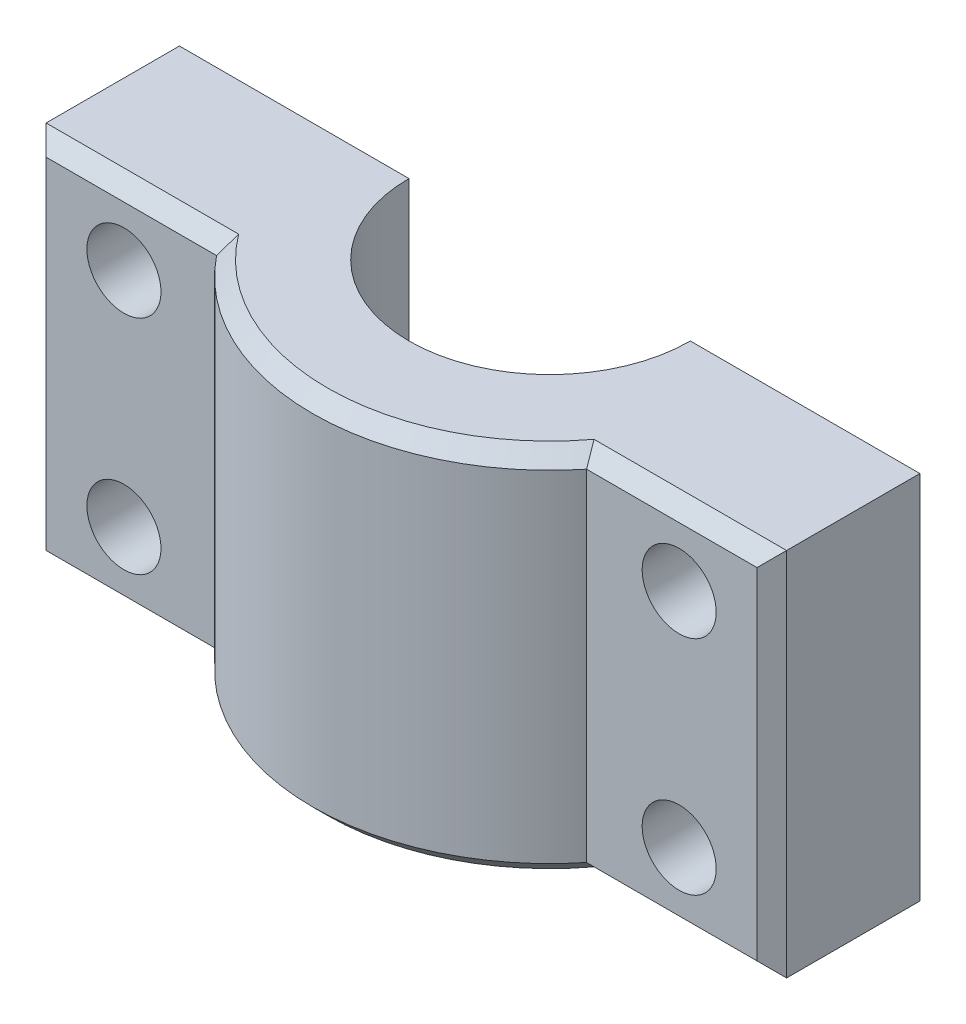
ISO-10303-21;
HEADER;
FILE_DESCRIPTION(('STEP AP214'),'2;1');
FILE_NAME('part.step','',(''),(''),'','','');
FILE_SCHEMA(('AUTOMOTIVE_DESIGN { 1 0 10303 214 1 1 1 1 }'));
ENDSEC;
DATA;
#1=APPLICATION_CONTEXT('core data for automotive mechanical design processes');
#2=APPLICATION_PROTOCOL_DEFINITION('international standard','automotive_design',2000,#1);
#3=PRODUCT_CONTEXT('',#1,'mechanical');
#4=PRODUCT('Part','Part','',(#3));
#5=PRODUCT_RELATED_PRODUCT_CATEGORY('part','',(#4));
#6=PRODUCT_DEFINITION_FORMATION('','',#4);
#7=PRODUCT_DEFINITION_CONTEXT('part definition',#1,'design');
#8=PRODUCT_DEFINITION('design','',#6,#7);
#9=PRODUCT_DEFINITION_SHAPE('','',#8);
#10=(LENGTH_UNIT() NAMED_UNIT(*) SI_UNIT(.MILLI.,.METRE.));
#11=(NAMED_UNIT(*) PLANE_ANGLE_UNIT() SI_UNIT($,.RADIAN.));
#12=(NAMED_UNIT(*) SI_UNIT($,.STERADIAN.) SOLID_ANGLE_UNIT());
#13=UNCERTAINTY_MEASURE_WITH_UNIT(LENGTH_MEASURE(1.E-05),#10,'distance_accuracy_value','');
#14=(GEOMETRIC_REPRESENTATION_CONTEXT(3) GLOBAL_UNCERTAINTY_ASSIGNED_CONTEXT((#13)) GLOBAL_UNIT_ASSIGNED_CONTEXT((#10,
#11,#12)) REPRESENTATION_CONTEXT('',''));
#15=CARTESIAN_POINT('',(0.,0.,0.));
#16=DIRECTION('',(0.,0.,1.));
#17=DIRECTION('',(1.,0.,0.));
#18=AXIS2_PLACEMENT_3D('',#15,#16,#17);
#19=CARTESIAN_POINT('',(0.,12.5,0.));
#20=DIRECTION('',(0.,1.,0.));
#21=DIRECTION('',(0.,0.,1.));
#22=AXIS2_PLACEMENT_3D('',#19,#20,#21);
#23=PLANE('',#22);
#24=DIRECTION('',(0.,0.,-1.));
#25=VECTOR('',#24,1.);
#26=CARTESIAN_POINT('',(12.5,12.5,-5.));
#27=LINE('',#26,#25);
#28=CARTESIAN_POINT('',(12.5,12.5,4.49999999999999));
#29=VERTEX_POINT('',#28);
#30=CARTESIAN_POINT('',(12.5,12.5,0.));
#31=VERTEX_POINT('',#30);
#32=EDGE_CURVE('E147',#29,#31,#27,.T.);
#33=ORIENTED_EDGE('',*,*,#32,.T.);
#34=DIRECTION('',(-1.,0.,0.));
#35=VECTOR('',#34,1.);
#36=CARTESIAN_POINT('',(0.,12.5,0.));
#37=LINE('',#36,#35);
#38=CARTESIAN_POINT('',(4.75,12.5,0.));
#39=VERTEX_POINT('',#38);
#40=EDGE_CURVE('E132',#31,#39,#37,.T.);
#41=ORIENTED_EDGE('',*,*,#40,.T.);
#42=CARTESIAN_POINT('',(0.,12.5,0.));
#43=DIRECTION('',(0.,1.,0.));
#44=DIRECTION('',(0.,0.,1.));
#45=AXIS2_PLACEMENT_3D('',#42,#43,#44);
#46=CIRCLE('',#45,4.75);
#47=CARTESIAN_POINT('',(-4.75,12.5,0.));
#48=VERTEX_POINT('',#47);
#49=EDGE_CURVE('E144',#48,#39,#46,.T.);
#50=ORIENTED_EDGE('',*,*,#49,.F.);
#51=CARTESIAN_POINT('',(-12.5,12.5,0.));
#52=VERTEX_POINT('',#51);
#53=EDGE_CURVE('E57',#48,#52,#37,.T.);
#54=ORIENTED_EDGE('',*,*,#53,.T.);
#55=DIRECTION('',(0.,0.,1.));
#56=VECTOR('',#55,1.);
#57=CARTESIAN_POINT('',(-12.5,12.5,-5.));
#58=LINE('',#57,#56);
#59=CARTESIAN_POINT('',(-12.5,12.5,4.5));
#60=VERTEX_POINT('',#59);
#61=EDGE_CURVE('E159',#52,#60,#58,.T.);
#62=ORIENTED_EDGE('',*,*,#61,.T.);
#63=DIRECTION('',(1.,0.,0.));
#64=VECTOR('',#63,1.);
#65=CARTESIAN_POINT('',(0.,12.5,4.5));
#66=LINE('',#65,#64);
#67=CARTESIAN_POINT('',(-6.,12.5,4.5));
#68=VERTEX_POINT('',#67);
#69=EDGE_CURVE('E184',#60,#68,#66,.T.);
#70=ORIENTED_EDGE('',*,*,#69,.T.);
#71=CARTESIAN_POINT('',(0.,12.5,0.));
#72=DIRECTION('',(0.,1.,0.));
#73=DIRECTION('',(0.,0.,1.));
#74=AXIS2_PLACEMENT_3D('',#71,#72,#73);
#75=CIRCLE('',#74,7.5);
#76=CARTESIAN_POINT('',(6.,12.5,4.49999999999999));
#77=VERTEX_POINT('',#76);
#78=EDGE_CURVE('E196',#68,#77,#75,.T.);
#79=ORIENTED_EDGE('',*,*,#78,.T.);
#80=DIRECTION('',(1.,0.,0.));
#81=VECTOR('',#80,1.);
#82=CARTESIAN_POINT('',(0.,12.5,4.5));
#83=LINE('',#82,#81);
#84=EDGE_CURVE('E199',#77,#29,#83,.T.);
#85=ORIENTED_EDGE('',*,*,#84,.T.);
#86=EDGE_LOOP('',(#33,#41,#50,#54,#62,#70,#79,#85));
#87=FACE_BOUND('',#86,.T.);
#88=ADVANCED_FACE('F39',(#87),#23,.T.);
#89=CARTESIAN_POINT('',(0.,0.,0.));
#90=DIRECTION('',(0.,1.,0.));
#91=DIRECTION('',(0.,0.,1.));
#92=AXIS2_PLACEMENT_3D('',#89,#90,#91);
#93=PLANE('',#92);
#94=DIRECTION('',(-1.,0.,0.));
#95=VECTOR('',#94,1.);
#96=CARTESIAN_POINT('',(0.,0.,0.));
#97=LINE('',#96,#95);
#98=CARTESIAN_POINT('',(12.5,0.,0.));
#99=VERTEX_POINT('',#98);
#100=CARTESIAN_POINT('',(4.75,0.,0.));
#101=VERTEX_POINT('',#100);
#102=EDGE_CURVE('E65',#99,#101,#97,.T.);
#103=ORIENTED_EDGE('',*,*,#102,.F.);
#104=DIRECTION('',(0.,0.,1.));
#105=VECTOR('',#104,1.);
#106=CARTESIAN_POINT('',(12.5,0.,-5.));
#107=LINE('',#106,#105);
#108=CARTESIAN_POINT('',(12.5,0.,4.5));
#109=VERTEX_POINT('',#108);
#110=EDGE_CURVE('E165',#99,#109,#107,.T.);
#111=ORIENTED_EDGE('',*,*,#110,.T.);
#112=DIRECTION('',(-1.,0.,0.));
#113=VECTOR('',#112,1.);
#114=CARTESIAN_POINT('',(6.2449979983984,0.,4.5));
#115=LINE('',#114,#113);
#116=CARTESIAN_POINT('',(6.,0.,4.49999999999999));
#117=VERTEX_POINT('',#116);
#118=EDGE_CURVE('E49',#109,#117,#115,.T.);
#119=ORIENTED_EDGE('',*,*,#118,.T.);
#120=CARTESIAN_POINT('',(0.,0.,0.));
#121=DIRECTION('',(0.,1.,0.));
#122=DIRECTION('',(0.,0.,1.));
#123=AXIS2_PLACEMENT_3D('',#120,#121,#122);
#124=CIRCLE('',#123,7.5);
#125=CARTESIAN_POINT('',(-6.,0.,4.5));
#126=VERTEX_POINT('',#125);
#127=EDGE_CURVE('E234',#117,#126,#124,.F.);
#128=ORIENTED_EDGE('',*,*,#127,.T.);
#129=DIRECTION('',(-1.,0.,0.));
#130=VECTOR('',#129,1.);
#131=CARTESIAN_POINT('',(-12.5,0.,4.5));
#132=LINE('',#131,#130);
#133=CARTESIAN_POINT('',(-12.5,0.,4.5));
#134=VERTEX_POINT('',#133);
#135=EDGE_CURVE('E231',#126,#134,#132,.T.);
#136=ORIENTED_EDGE('',*,*,#135,.T.);
#137=DIRECTION('',(0.,0.,-1.));
#138=VECTOR('',#137,1.);
#139=CARTESIAN_POINT('',(-12.5,0.,-5.));
#140=LINE('',#139,#138);
#141=CARTESIAN_POINT('',(-12.5,0.,0.));
#142=VERTEX_POINT('',#141);
#143=EDGE_CURVE('E168',#134,#142,#140,.T.);
#144=ORIENTED_EDGE('',*,*,#143,.T.);
#145=CARTESIAN_POINT('',(-4.75,0.,0.));
#146=VERTEX_POINT('',#145);
#147=EDGE_CURVE('E349',#146,#142,#97,.T.);
#148=ORIENTED_EDGE('',*,*,#147,.F.);
#149=CARTESIAN_POINT('',(0.,0.,0.));
#150=DIRECTION('',(0.,1.,0.));
#151=DIRECTION('',(0.,0.,1.));
#152=AXIS2_PLACEMENT_3D('',#149,#150,#151);
#153=CIRCLE('',#152,4.75);
#154=EDGE_CURVE('E154',#146,#101,#153,.T.);
#155=ORIENTED_EDGE('',*,*,#154,.T.);
#156=EDGE_LOOP('',(#103,#111,#119,#128,#136,#144,#148,#155));
#157=FACE_BOUND('',#156,.T.);
#158=ADVANCED_FACE('F374',(#157),#93,.F.);
#159=CARTESIAN_POINT('',(-12.5,-26.9258240356725,-5.));
#160=DIRECTION('',(-1.,0.,0.));
#161=DIRECTION('',(0.,0.,1.));
#162=AXIS2_PLACEMENT_3D('',#159,#160,#161);
#163=PLANE('',#162);
#164=ORIENTED_EDGE('',*,*,#61,.F.);
#165=DIRECTION('',(0.,-1.,0.));
#166=VECTOR('',#165,1.);
#167=CARTESIAN_POINT('',(-12.5,-26.9258240356725,0.));
#168=LINE('',#167,#166);
#169=EDGE_CURVE('E243',#52,#142,#168,.T.);
#170=ORIENTED_EDGE('',*,*,#169,.T.);
#171=ORIENTED_EDGE('',*,*,#143,.F.);
#172=DIRECTION('',(0.,1.,0.));
#173=VECTOR('',#172,1.);
#174=CARTESIAN_POINT('',(-12.5,-26.9258240356725,4.5));
#175=LINE('',#174,#173);
#176=EDGE_CURVE('E11',#134,#60,#175,.T.);
#177=ORIENTED_EDGE('',*,*,#176,.T.);
#178=EDGE_LOOP('',(#164,#170,#171,#177));
#179=FACE_BOUND('',#178,.T.);
#180=ADVANCED_FACE('F379',(#179),#163,.T.);
#181=CARTESIAN_POINT('',(12.5,-26.9258240356725,-5.));
#182=DIRECTION('',(1.,0.,0.));
#183=DIRECTION('',(0.,0.,-1.));
#184=AXIS2_PLACEMENT_3D('',#181,#182,#183);
#185=PLANE('',#184);
#186=ORIENTED_EDGE('',*,*,#110,.F.);
#187=DIRECTION('',(0.,1.,0.));
#188=VECTOR('',#187,1.);
#189=CARTESIAN_POINT('',(12.5,-26.9258240356725,0.));
#190=LINE('',#189,#188);
#191=EDGE_CURVE('E149',#99,#31,#190,.T.);
#192=ORIENTED_EDGE('',*,*,#191,.T.);
#193=ORIENTED_EDGE('',*,*,#32,.F.);
#194=DIRECTION('',(0.,-1.,0.));
#195=VECTOR('',#194,1.);
#196=CARTESIAN_POINT('',(12.5,-26.9258240356725,4.49999999999999));
#197=LINE('',#196,#195);
#198=EDGE_CURVE('E227',#29,#109,#197,.T.);
#199=ORIENTED_EDGE('',*,*,#198,.T.);
#200=EDGE_LOOP('',(#186,#192,#193,#199));
#201=FACE_BOUND('',#200,.T.);
#202=ADVANCED_FACE('F345',(#201),#185,.T.);
#203=CARTESIAN_POINT('',(0.,0.,0.));
#204=DIRECTION('',(0.,1.,0.));
#205=DIRECTION('',(0.,0.,1.));
#206=AXIS2_PLACEMENT_3D('',#203,#204,#205);
#207=CYLINDRICAL_SURFACE('',#206,4.75);
#208=DIRECTION('',(0.,1.,0.));
#209=VECTOR('',#208,1.);
#210=CARTESIAN_POINT('',(-4.75,0.,0.));
#211=LINE('',#210,#209);
#212=EDGE_CURVE('E152',#48,#146,#211,.F.);
#213=ORIENTED_EDGE('',*,*,#212,.F.);
#214=ORIENTED_EDGE('',*,*,#49,.T.);
#215=DIRECTION('',(0.,1.,0.));
#216=VECTOR('',#215,1.);
#217=CARTESIAN_POINT('',(4.75,0.,0.));
#218=LINE('',#217,#216);
#219=EDGE_CURVE('E128',#101,#39,#218,.T.);
#220=ORIENTED_EDGE('',*,*,#219,.F.);
#221=ORIENTED_EDGE('',*,*,#154,.F.);
#222=EDGE_LOOP('',(#213,#214,#220,#221));
#223=FACE_BOUND('',#222,.T.);
#224=ADVANCED_FACE('F151',(#223),#207,.F.);
#225=CARTESIAN_POINT('',(-9.3724989991992,10.,8.));
#226=DIRECTION('',(0.,0.,-1.));
#227=DIRECTION('',(-1.,0.,0.));
#228=AXIS2_PLACEMENT_3D('',#225,#226,#227);
#229=CYLINDRICAL_SURFACE('',#228,1.25);
#230=CARTESIAN_POINT('',(-9.3724989991992,10.,5.));
#231=DIRECTION('',(0.,0.,1.));
#232=DIRECTION('',(1.,0.,0.));
#233=AXIS2_PLACEMENT_3D('',#230,#231,#232);
#234=CIRCLE('',#233,1.25);
#235=CARTESIAN_POINT('',(-8.1224989991992,10.,5.));
#236=VERTEX_POINT('',#235);
#237=EDGE_CURVE('E162',#236,#236,#234,.T.);
#238=ORIENTED_EDGE('',*,*,#237,.T.);
#239=EDGE_LOOP('',(#238));
#240=FACE_BOUND('',#239,.T.);
#241=CARTESIAN_POINT('',(-9.3724989991992,10.,0.));
#242=DIRECTION('',(0.,0.,-1.));
#243=DIRECTION('',(-1.,0.,0.));
#244=AXIS2_PLACEMENT_3D('',#241,#242,#243);
#245=CIRCLE('',#244,1.25);
#246=CARTESIAN_POINT('',(-10.6224989991992,10.,0.));
#247=VERTEX_POINT('',#246);
#248=EDGE_CURVE('E139',#247,#247,#245,.F.);
#249=ORIENTED_EDGE('',*,*,#248,.F.);
#250=EDGE_LOOP('',(#249));
#251=FACE_BOUND('',#250,.T.);
#252=ADVANCED_FACE('F360',(#240,#251),#229,.F.);
#253=CARTESIAN_POINT('',(-9.3724989991992,2.5,8.));
#254=DIRECTION('',(0.,0.,-1.));
#255=DIRECTION('',(-1.,0.,0.));
#256=AXIS2_PLACEMENT_3D('',#253,#254,#255);
#257=CYLINDRICAL_SURFACE('',#256,1.25);
#258=CARTESIAN_POINT('',(-9.3724989991992,2.5,5.));
#259=DIRECTION('',(0.,0.,1.));
#260=DIRECTION('',(1.,0.,0.));
#261=AXIS2_PLACEMENT_3D('',#258,#259,#260);
#262=CIRCLE('',#261,1.25);
#263=CARTESIAN_POINT('',(-8.1224989991992,2.5,5.));
#264=VERTEX_POINT('',#263);
#265=EDGE_CURVE('E155',#264,#264,#262,.T.);
#266=ORIENTED_EDGE('',*,*,#265,.T.);
#267=EDGE_LOOP('',(#266));
#268=FACE_BOUND('',#267,.T.);
#269=CARTESIAN_POINT('',(-9.3724989991992,2.5,0.));
#270=DIRECTION('',(0.,0.,-1.));
#271=DIRECTION('',(-1.,0.,0.));
#272=AXIS2_PLACEMENT_3D('',#269,#270,#271);
#273=CIRCLE('',#272,1.25);
#274=CARTESIAN_POINT('',(-10.6224989991992,2.5,0.));
#275=VERTEX_POINT('',#274);
#276=EDGE_CURVE('E397',#275,#275,#273,.F.);
#277=ORIENTED_EDGE('',*,*,#276,.F.);
#278=EDGE_LOOP('',(#277));
#279=FACE_BOUND('',#278,.T.);
#280=ADVANCED_FACE('F424',(#268,#279),#257,.F.);
#281=CARTESIAN_POINT('',(9.3724989991992,10.,8.));
#282=DIRECTION('',(0.,0.,-1.));
#283=DIRECTION('',(-1.,0.,0.));
#284=AXIS2_PLACEMENT_3D('',#281,#282,#283);
#285=CYLINDRICAL_SURFACE('',#284,1.25);
#286=CARTESIAN_POINT('',(9.3724989991992,10.,5.));
#287=DIRECTION('',(0.,0.,1.));
#288=DIRECTION('',(1.,0.,0.));
#289=AXIS2_PLACEMENT_3D('',#286,#287,#288);
#290=CIRCLE('',#289,1.25);
#291=CARTESIAN_POINT('',(10.6224989991992,10.,5.));
#292=VERTEX_POINT('',#291);
#293=EDGE_CURVE('E185',#292,#292,#290,.F.);
#294=ORIENTED_EDGE('',*,*,#293,.F.);
#295=EDGE_LOOP('',(#294));
#296=FACE_BOUND('',#295,.T.);
#297=CARTESIAN_POINT('',(9.3724989991992,10.,0.));
#298=DIRECTION('',(0.,0.,-1.));
#299=DIRECTION('',(-1.,0.,0.));
#300=AXIS2_PLACEMENT_3D('',#297,#298,#299);
#301=CIRCLE('',#300,1.25);
#302=CARTESIAN_POINT('',(8.1224989991992,10.,0.));
#303=VERTEX_POINT('',#302);
#304=EDGE_CURVE('E401',#303,#303,#301,.T.);
#305=ORIENTED_EDGE('',*,*,#304,.T.);
#306=EDGE_LOOP('',(#305));
#307=FACE_BOUND('',#306,.T.);
#308=ADVANCED_FACE('F420',(#296,#307),#285,.F.);
#309=CARTESIAN_POINT('',(9.3724989991992,2.5,8.));
#310=DIRECTION('',(0.,0.,-1.));
#311=DIRECTION('',(-1.,0.,0.));
#312=AXIS2_PLACEMENT_3D('',#309,#310,#311);
#313=CYLINDRICAL_SURFACE('',#312,1.25);
#314=CARTESIAN_POINT('',(9.3724989991992,2.5,5.));
#315=DIRECTION('',(0.,0.,1.));
#316=DIRECTION('',(1.,0.,0.));
#317=AXIS2_PLACEMENT_3D('',#314,#315,#316);
#318=CIRCLE('',#317,1.25);
#319=CARTESIAN_POINT('',(10.6224989991992,2.5,5.));
#320=VERTEX_POINT('',#319);
#321=EDGE_CURVE('E189',#320,#320,#318,.F.);
#322=ORIENTED_EDGE('',*,*,#321,.F.);
#323=EDGE_LOOP('',(#322));
#324=FACE_BOUND('',#323,.T.);
#325=CARTESIAN_POINT('',(9.3724989991992,2.5,0.));
#326=DIRECTION('',(0.,0.,-1.));
#327=DIRECTION('',(-1.,0.,0.));
#328=AXIS2_PLACEMENT_3D('',#325,#326,#327);
#329=CIRCLE('',#328,1.25);
#330=CARTESIAN_POINT('',(8.1224989991992,2.5,0.));
#331=VERTEX_POINT('',#330);
#332=EDGE_CURVE('E43',#331,#331,#329,.T.);
#333=ORIENTED_EDGE('',*,*,#332,.T.);
#334=EDGE_LOOP('',(#333));
#335=FACE_BOUND('',#334,.T.);
#336=ADVANCED_FACE('F370',(#324,#335),#313,.F.);
#337=CARTESIAN_POINT('',(0.,12.5,0.));
#338=DIRECTION('',(0.,-1.,0.));
#339=DIRECTION('',(0.,0.,-1.));
#340=AXIS2_PLACEMENT_3D('',#337,#338,#339);
#341=CYLINDRICAL_SURFACE('',#340,8.);
#342=DIRECTION('',(0.,-1.,0.));
#343=VECTOR('',#342,1.);
#344=CARTESIAN_POINT('',(6.2449979983984,12.5,5.));
#345=LINE('',#344,#343);
#346=CARTESIAN_POINT('',(6.2449979983984,0.500000000000004,5.));
#347=VERTEX_POINT('',#346);
#348=CARTESIAN_POINT('',(6.2449979983984,12.,5.));
#349=VERTEX_POINT('',#348);
#350=EDGE_CURVE('E172',#347,#349,#345,.F.);
#351=ORIENTED_EDGE('',*,*,#350,.T.);
#352=CARTESIAN_POINT('',(0.,12.,0.));
#353=DIRECTION('',(0.,1.,0.));
#354=DIRECTION('',(0.,0.,1.));
#355=AXIS2_PLACEMENT_3D('',#352,#353,#354);
#356=CIRCLE('',#355,8.);
#357=CARTESIAN_POINT('',(-6.2449979983984,12.,5.));
#358=VERTEX_POINT('',#357);
#359=EDGE_CURVE('E215',#349,#358,#356,.F.);
#360=ORIENTED_EDGE('',*,*,#359,.T.);
#361=DIRECTION('',(0.,-1.,0.));
#362=VECTOR('',#361,1.);
#363=CARTESIAN_POINT('',(-6.2449979983984,12.5,5.));
#364=LINE('',#363,#362);
#365=CARTESIAN_POINT('',(-6.2449979983984,0.500000000000004,5.));
#366=VERTEX_POINT('',#365);
#367=EDGE_CURVE('E180',#358,#366,#364,.T.);
#368=ORIENTED_EDGE('',*,*,#367,.T.);
#369=CARTESIAN_POINT('',(0.,0.500000000000004,0.));
#370=DIRECTION('',(0.,1.,0.));
#371=DIRECTION('',(0.,0.,1.));
#372=AXIS2_PLACEMENT_3D('',#369,#370,#371);
#373=CIRCLE('',#372,8.);
#374=EDGE_CURVE('E212',#366,#347,#373,.T.);
#375=ORIENTED_EDGE('',*,*,#374,.T.);
#376=EDGE_LOOP('',(#351,#360,#368,#375));
#377=FACE_BOUND('',#376,.T.);
#378=ADVANCED_FACE('F324',(#377),#341,.T.);
#379=CARTESIAN_POINT('',(12.5,-26.9258240356725,5.));
#380=DIRECTION('',(0.,0.,1.));
#381=DIRECTION('',(1.,0.,0.));
#382=AXIS2_PLACEMENT_3D('',#379,#380,#381);
#383=PLANE('',#382);
#384=ORIENTED_EDGE('',*,*,#367,.F.);
#385=DIRECTION('',(-1.,0.,0.));
#386=VECTOR('',#385,1.);
#387=CARTESIAN_POINT('',(12.5,12.,5.));
#388=LINE('',#387,#386);
#389=CARTESIAN_POINT('',(-12.,12.,5.));
#390=VERTEX_POINT('',#389);
#391=EDGE_CURVE('E224',#358,#390,#388,.T.);
#392=ORIENTED_EDGE('',*,*,#391,.T.);
#393=DIRECTION('',(0.,-1.,0.));
#394=VECTOR('',#393,1.);
#395=CARTESIAN_POINT('',(-12.,-26.9258240356725,5.));
#396=LINE('',#395,#394);
#397=CARTESIAN_POINT('',(-12.,0.500000000000004,5.));
#398=VERTEX_POINT('',#397);
#399=EDGE_CURVE('E218',#390,#398,#396,.T.);
#400=ORIENTED_EDGE('',*,*,#399,.T.);
#401=DIRECTION('',(1.,0.,0.));
#402=VECTOR('',#401,1.);
#403=CARTESIAN_POINT('',(-6.2449979983984,0.500000000000004,5.));
#404=LINE('',#403,#402);
#405=EDGE_CURVE('E221',#398,#366,#404,.T.);
#406=ORIENTED_EDGE('',*,*,#405,.T.);
#407=EDGE_LOOP('',(#384,#392,#400,#406));
#408=FACE_BOUND('',#407,.T.);
#409=ORIENTED_EDGE('',*,*,#265,.F.);
#410=EDGE_LOOP('',(#409));
#411=FACE_BOUND('',#410,.T.);
#412=ORIENTED_EDGE('',*,*,#237,.F.);
#413=EDGE_LOOP('',(#412));
#414=FACE_BOUND('',#413,.T.);
#415=ADVANCED_FACE('F320',(#408,#411,#414),#383,.T.);
#416=ORIENTED_EDGE('',*,*,#321,.T.);
#417=EDGE_LOOP('',(#416));
#418=FACE_BOUND('',#417,.T.);
#419=ORIENTED_EDGE('',*,*,#293,.T.);
#420=EDGE_LOOP('',(#419));
#421=FACE_BOUND('',#420,.T.);
#422=DIRECTION('',(0.,1.,0.));
#423=VECTOR('',#422,1.);
#424=CARTESIAN_POINT('',(12.,-26.9258240356725,5.));
#425=LINE('',#424,#423);
#426=CARTESIAN_POINT('',(12.,0.500000000000004,5.));
#427=VERTEX_POINT('',#426);
#428=CARTESIAN_POINT('',(12.,12.,5.));
#429=VERTEX_POINT('',#428);
#430=EDGE_CURVE('E205',#427,#429,#425,.T.);
#431=ORIENTED_EDGE('',*,*,#430,.T.);
#432=DIRECTION('',(-1.,0.,0.));
#433=VECTOR('',#432,1.);
#434=CARTESIAN_POINT('',(12.5,12.,5.));
#435=LINE('',#434,#433);
#436=EDGE_CURVE('E208',#429,#349,#435,.T.);
#437=ORIENTED_EDGE('',*,*,#436,.T.);
#438=ORIENTED_EDGE('',*,*,#350,.F.);
#439=DIRECTION('',(1.,0.,0.));
#440=VECTOR('',#439,1.);
#441=CARTESIAN_POINT('',(12.5,0.500000000000004,5.));
#442=LINE('',#441,#440);
#443=EDGE_CURVE('E202',#347,#427,#442,.T.);
#444=ORIENTED_EDGE('',*,*,#443,.T.);
#445=EDGE_LOOP('',(#431,#437,#438,#444));
#446=FACE_BOUND('',#445,.T.);
#447=ADVANCED_FACE('F333',(#418,#421,#446),#383,.T.);
#448=CARTESIAN_POINT('',(0.,0.,4.5));
#449=DIRECTION('',(0.,-0.707106781186547,0.707106781186547));
#450=DIRECTION('',(1.,0.,0.));
#451=AXIS2_PLACEMENT_3D('',#448,#449,#450);
#452=PLANE('',#451);
#453=CARTESIAN_POINT('',(-6.,0.,4.49999999999999));
#454=CARTESIAN_POINT('',(-6.04156237570987,0.0831546665155898,4.58315466651558));
#455=CARTESIAN_POINT('',(-6.08276006962624,0.166398679340361,4.66639867934036));
#456=CARTESIAN_POINT('',(-6.16442606864172,0.333065346117437,4.83306534611744));
#457=CARTESIAN_POINT('',(-6.20489437419149,0.416487999959331,4.91648799995933));
#458=CARTESIAN_POINT('',(-6.24499799839844,0.499999999999993,4.99999999999999));
#459=B_SPLINE_CURVE_WITH_KNOTS('',3,(#453,#454,#455,#456,#457,#458),.UNSPECIFIED.,.F.,.F.,(4,2,
4),(0.,0.374175669889589,0.748351108579869),.UNSPECIFIED.);
#460=EDGE_CURVE('E297',#366,#126,#459,.F.);
#461=ORIENTED_EDGE('',*,*,#460,.F.);
#462=ORIENTED_EDGE('',*,*,#405,.F.);
#463=DIRECTION('',(-0.577350269189623,-0.577350269189627,-0.577350269189627));
#464=VECTOR('',#463,1.);
#465=CARTESIAN_POINT('',(-21.4752746785575,-8.97527467855755,-4.47527467855755));
#466=LINE('',#465,#464);
#467=EDGE_CURVE('E190',#134,#398,#466,.F.);
#468=ORIENTED_EDGE('',*,*,#467,.F.);
#469=ORIENTED_EDGE('',*,*,#135,.F.);
#470=EDGE_LOOP('',(#461,#462,#468,#469));
#471=FACE_BOUND('',#470,.T.);
#472=ADVANCED_FACE('F293',(#471),#452,.T.);
#473=CARTESIAN_POINT('',(-12.5,-26.9258240356725,4.5));
#474=DIRECTION('',(0.70710678118655,0.,-0.707106781186545));
#475=DIRECTION('',(0.,1.,0.));
#476=AXIS2_PLACEMENT_3D('',#473,#474,#475);
#477=PLANE('',#476);
#478=ORIENTED_EDGE('',*,*,#467,.T.);
#479=ORIENTED_EDGE('',*,*,#399,.F.);
#480=DIRECTION('',(-0.577350269189622,0.57735026918963,-0.577350269189626));
#481=VECTOR('',#480,1.);
#482=CARTESIAN_POINT('',(0.641941345224174,-0.641941345224363,17.6419413452243));
#483=LINE('',#482,#481);
#484=EDGE_CURVE('E304',#60,#390,#483,.F.);
#485=ORIENTED_EDGE('',*,*,#484,.F.);
#486=ORIENTED_EDGE('',*,*,#176,.F.);
#487=EDGE_LOOP('',(#478,#479,#485,#486));
#488=FACE_BOUND('',#487,.T.);
#489=ADVANCED_FACE('F41',(#488),#477,.F.);
#490=CARTESIAN_POINT('',(0.,0.500000000000004,0.));
#491=DIRECTION('',(0.,1.,0.));
#492=DIRECTION('',(0.,0.,1.));
#493=AXIS2_PLACEMENT_3D('',#490,#491,#492);
#494=CONICAL_SURFACE('',#493,8.,0.785398163397448);
#495=ORIENTED_EDGE('',*,*,#460,.T.);
#496=ORIENTED_EDGE('',*,*,#127,.F.);
#497=CARTESIAN_POINT('',(6.00000000000001,0.,4.5));
#498=CARTESIAN_POINT('',(6.04156237570987,0.0831546665155918,4.58315466651559));
#499=CARTESIAN_POINT('',(6.08276006962625,0.166398679340364,4.66639867934036));
#500=CARTESIAN_POINT('',(6.16442606864172,0.333065346117441,4.83306534611744));
#501=CARTESIAN_POINT('',(6.20489437419149,0.416487999959333,4.91648799995933));
#502=CARTESIAN_POINT('',(6.24499799839844,0.499999999999993,4.99999999999999));
#503=B_SPLINE_CURVE_WITH_KNOTS('',3,(#497,#498,#499,#500,#501,#502),.UNSPECIFIED.,.F.,.F.,(4,2,
4),(0.,0.374175669889585,0.748351108579861),.UNSPECIFIED.);
#504=EDGE_CURVE('E274',#347,#117,#503,.F.);
#505=ORIENTED_EDGE('',*,*,#504,.F.);
#506=ORIENTED_EDGE('',*,*,#374,.F.);
#507=EDGE_LOOP('',(#495,#496,#505,#506));
#508=FACE_BOUND('',#507,.T.);
#509=ADVANCED_FACE('F285',(#508),#494,.T.);
#510=CARTESIAN_POINT('',(0.,12.5,4.5));
#511=DIRECTION('',(0.,-0.707106781186545,-0.70710678118655));
#512=DIRECTION('',(1.,0.,0.));
#513=AXIS2_PLACEMENT_3D('',#510,#511,#512);
#514=PLANE('',#513);
#515=ORIENTED_EDGE('',*,*,#484,.T.);
#516=ORIENTED_EDGE('',*,*,#391,.F.);
#517=CARTESIAN_POINT('',(-6.2449979983984,12.,5.));
#518=CARTESIAN_POINT('',(-6.20489437419147,12.0835120000407,4.91648799995933));
#519=CARTESIAN_POINT('',(-6.16442606864171,12.1669346538826,4.83306534611744));
#520=CARTESIAN_POINT('',(-6.08276006962626,12.3336013206596,4.66639867934035));
#521=CARTESIAN_POINT('',(-6.04156237570989,12.4168453334844,4.58315466651558));
#522=CARTESIAN_POINT('',(-6.00000000000003,12.5,4.49999999999999));
#523=B_SPLINE_CURVE_WITH_KNOTS('',3,(#517,#518,#519,#520,#521,#522),.UNSPECIFIED.,.F.,.F.,(4,2,
4),(0.,0.374175438690282,0.74835110857987),.UNSPECIFIED.);
#524=EDGE_CURVE('E266',#68,#358,#523,.F.);
#525=ORIENTED_EDGE('',*,*,#524,.F.);
#526=ORIENTED_EDGE('',*,*,#69,.F.);
#527=EDGE_LOOP('',(#515,#516,#525,#526));
#528=FACE_BOUND('',#527,.T.);
#529=ADVANCED_FACE('F282',(#528),#514,.F.);
#530=CARTESIAN_POINT('',(0.,0.,4.5));
#531=DIRECTION('',(0.,-0.707106781186547,0.707106781186548));
#532=DIRECTION('',(1.,0.,0.));
#533=AXIS2_PLACEMENT_3D('',#530,#531,#532);
#534=PLANE('',#533);
#535=ORIENTED_EDGE('',*,*,#504,.T.);
#536=ORIENTED_EDGE('',*,*,#118,.F.);
#537=DIRECTION('',(0.577350269189624,-0.577350269189627,-0.577350269189626));
#538=VECTOR('',#537,1.);
#539=CARTESIAN_POINT('',(8.33333333333335,4.16666666666666,8.66666666666665));
#540=LINE('',#539,#538);
#541=EDGE_CURVE('E252',#427,#109,#540,.T.);
#542=ORIENTED_EDGE('',*,*,#541,.F.);
#543=ORIENTED_EDGE('',*,*,#443,.F.);
#544=EDGE_LOOP('',(#535,#536,#542,#543));
#545=FACE_BOUND('',#544,.T.);
#546=ADVANCED_FACE('F262',(#545),#534,.T.);
#547=CARTESIAN_POINT('',(0.,12.5,0.));
#548=DIRECTION('',(0.,-1.,0.));
#549=DIRECTION('',(0.,0.,-1.));
#550=AXIS2_PLACEMENT_3D('',#547,#548,#549);
#551=CONICAL_SURFACE('',#550,7.5,0.785398163397448);
#552=ORIENTED_EDGE('',*,*,#524,.T.);
#553=ORIENTED_EDGE('',*,*,#359,.F.);
#554=CARTESIAN_POINT('',(6.2449979983984,12.,5.));
#555=CARTESIAN_POINT('',(6.20489437419147,12.0835120000407,4.91648799995933));
#556=CARTESIAN_POINT('',(6.16442606864172,12.1669346538826,4.83306534611744));
#557=CARTESIAN_POINT('',(6.08276006962626,12.3336013206596,4.66639867934036));
#558=CARTESIAN_POINT('',(6.04156237570989,12.4168453334844,4.58315466651558));
#559=CARTESIAN_POINT('',(6.00000000000003,12.5,4.49999999999999));
#560=B_SPLINE_CURVE_WITH_KNOTS('',3,(#554,#555,#556,#557,#558,#559),.UNSPECIFIED.,.F.,.F.,(4,2,
4),(0.,0.374175438690276,0.748351108579862),.UNSPECIFIED.);
#561=EDGE_CURVE('E242',#77,#349,#560,.F.);
#562=ORIENTED_EDGE('',*,*,#561,.F.);
#563=ORIENTED_EDGE('',*,*,#78,.F.);
#564=EDGE_LOOP('',(#552,#553,#562,#563));
#565=FACE_BOUND('',#564,.T.);
#566=ADVANCED_FACE('F257',(#565),#551,.T.);
#567=CARTESIAN_POINT('',(12.,-26.9258240356725,5.));
#568=DIRECTION('',(-0.707106781186549,0.,-0.707106781186546));
#569=DIRECTION('',(0.,1.,0.));
#570=AXIS2_PLACEMENT_3D('',#567,#568,#569);
#571=PLANE('',#570);
#572=ORIENTED_EDGE('',*,*,#541,.T.);
#573=ORIENTED_EDGE('',*,*,#198,.F.);
#574=DIRECTION('',(-0.577350269189623,-0.57735026918963,0.577350269189625));
#575=VECTOR('',#574,1.);
#576=CARTESIAN_POINT('',(-0.975274678557536,-0.975274678557684,17.9752746785576));
#577=LINE('',#576,#575);
#578=EDGE_CURVE('E239',#429,#29,#577,.F.);
#579=ORIENTED_EDGE('',*,*,#578,.F.);
#580=ORIENTED_EDGE('',*,*,#430,.F.);
#581=EDGE_LOOP('',(#572,#573,#579,#580));
#582=FACE_BOUND('',#581,.T.);
#583=ADVANCED_FACE('F261',(#582),#571,.F.);
#584=CARTESIAN_POINT('',(0.,12.5,4.5));
#585=DIRECTION('',(0.,-0.707106781186544,-0.707106781186551));
#586=DIRECTION('',(1.,0.,0.));
#587=AXIS2_PLACEMENT_3D('',#584,#585,#586);
#588=PLANE('',#587);
#589=ORIENTED_EDGE('',*,*,#561,.T.);
#590=ORIENTED_EDGE('',*,*,#436,.F.);
#591=ORIENTED_EDGE('',*,*,#578,.T.);
#592=ORIENTED_EDGE('',*,*,#84,.F.);
#593=EDGE_LOOP('',(#589,#590,#591,#592));
#594=FACE_BOUND('',#593,.T.);
#595=ADVANCED_FACE('F254',(#594),#588,.F.);
#596=CARTESIAN_POINT('',(0.,0.,0.));
#597=DIRECTION('',(0.,0.,-1.));
#598=DIRECTION('',(-1.,0.,0.));
#599=AXIS2_PLACEMENT_3D('',#596,#597,#598);
#600=PLANE('',#599);
#601=ORIENTED_EDGE('',*,*,#102,.T.);
#602=ORIENTED_EDGE('',*,*,#219,.T.);
#603=ORIENTED_EDGE('',*,*,#40,.F.);
#604=ORIENTED_EDGE('',*,*,#191,.F.);
#605=EDGE_LOOP('',(#601,#602,#603,#604));
#606=FACE_BOUND('',#605,.T.);
#607=ORIENTED_EDGE('',*,*,#304,.F.);
#608=EDGE_LOOP('',(#607));
#609=FACE_BOUND('',#608,.T.);
#610=ORIENTED_EDGE('',*,*,#332,.F.);
#611=EDGE_LOOP('',(#610));
#612=FACE_BOUND('',#611,.T.);
#613=ADVANCED_FACE('F130',(#606,#609,#612),#600,.T.);
#614=ORIENTED_EDGE('',*,*,#53,.F.);
#615=ORIENTED_EDGE('',*,*,#212,.T.);
#616=ORIENTED_EDGE('',*,*,#147,.T.);
#617=ORIENTED_EDGE('',*,*,#169,.F.);
#618=EDGE_LOOP('',(#614,#615,#616,#617));
#619=FACE_BOUND('',#618,.T.);
#620=ORIENTED_EDGE('',*,*,#248,.T.);
#621=EDGE_LOOP('',(#620));
#622=FACE_BOUND('',#621,.T.);
#623=ORIENTED_EDGE('',*,*,#276,.T.);
#624=EDGE_LOOP('',(#623));
#625=FACE_BOUND('',#624,.T.);
#626=ADVANCED_FACE('F411',(#619,#622,#625),#600,.T.);
#627=CLOSED_SHELL('',(#88,#158,#180,#202,#224,#252,#280,#308,#336,#378,#415,#447,#472,#489,#509,
#529,#546,#566,#583,#595,#613,#626));
#628=MANIFOLD_SOLID_BREP('B2',#627);
#629=ADVANCED_BREP_SHAPE_REPRESENTATION('',(#18,#628),#14);
#630=SHAPE_DEFINITION_REPRESENTATION(#9,#629);
ENDSEC;
END-ISO-10303-21;
